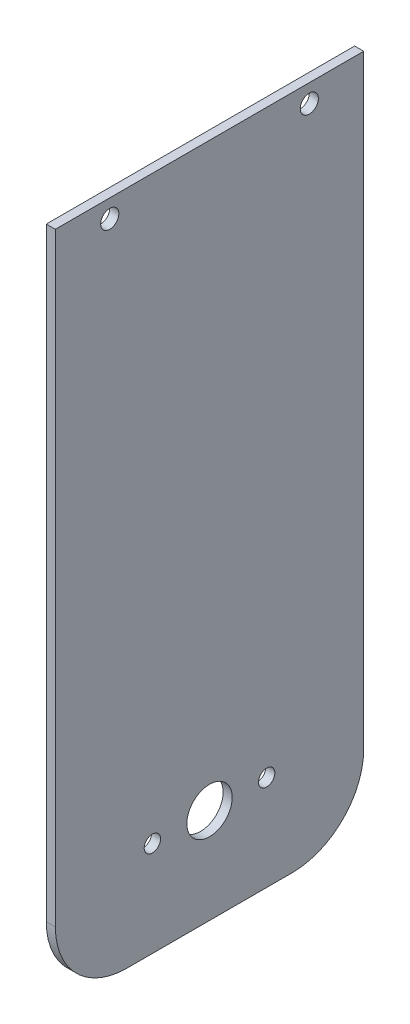
ISO-10303-21;
HEADER;
FILE_DESCRIPTION(('STEP AP214'),'2;1');
FILE_NAME('part.step','',(''),(''),'','','');
FILE_SCHEMA(('AUTOMOTIVE_DESIGN { 1 0 10303 214 1 1 1 1 }'));
ENDSEC;
DATA;
#1=APPLICATION_CONTEXT('core data for automotive mechanical design processes');
#2=APPLICATION_PROTOCOL_DEFINITION('international standard','automotive_design',2000,#1);
#3=PRODUCT_CONTEXT('',#1,'mechanical');
#4=PRODUCT('Part','Part','',(#3));
#5=PRODUCT_RELATED_PRODUCT_CATEGORY('part','',(#4));
#6=PRODUCT_DEFINITION_FORMATION('','',#4);
#7=PRODUCT_DEFINITION_CONTEXT('part definition',#1,'design');
#8=PRODUCT_DEFINITION('design','',#6,#7);
#9=PRODUCT_DEFINITION_SHAPE('','',#8);
#10=(LENGTH_UNIT() NAMED_UNIT(*) SI_UNIT(.MILLI.,.METRE.));
#11=(NAMED_UNIT(*) PLANE_ANGLE_UNIT() SI_UNIT($,.RADIAN.));
#12=(NAMED_UNIT(*) SI_UNIT($,.STERADIAN.) SOLID_ANGLE_UNIT());
#13=UNCERTAINTY_MEASURE_WITH_UNIT(LENGTH_MEASURE(1.E-05),#10,'distance_accuracy_value','');
#14=(GEOMETRIC_REPRESENTATION_CONTEXT(3) GLOBAL_UNCERTAINTY_ASSIGNED_CONTEXT((#13)) GLOBAL_UNIT_ASSIGNED_CONTEXT((#10,
#11,#12)) REPRESENTATION_CONTEXT('',''));
#15=CARTESIAN_POINT('',(0.,0.,0.));
#16=DIRECTION('',(0.,0.,1.));
#17=DIRECTION('',(1.,0.,0.));
#18=AXIS2_PLACEMENT_3D('',#15,#16,#17);
#19=CARTESIAN_POINT('',(3.175,0.,0.));
#20=DIRECTION('',(1.,0.,0.));
#21=DIRECTION('',(0.,0.,-1.));
#22=AXIS2_PLACEMENT_3D('',#19,#20,#21);
#23=PLANE('',#22);
#24=CARTESIAN_POINT('',(3.175,111.9175,34.925));
#25=DIRECTION('',(1.,0.,0.));
#26=DIRECTION('',(0.,0.,-1.));
#27=AXIS2_PLACEMENT_3D('',#24,#25,#26);
#28=CIRCLE('',#27,3.175);
#29=CARTESIAN_POINT('',(3.175,111.9175,31.75));
#30=VERTEX_POINT('',#29);
#31=EDGE_CURVE('E209',#30,#30,#28,.T.);
#32=ORIENTED_EDGE('',*,*,#31,.F.);
#33=EDGE_LOOP('',(#32));
#34=FACE_BOUND('',#33,.T.);
#35=CARTESIAN_POINT('',(3.175,-84.9275,-20.));
#36=DIRECTION('',(1.,0.,0.));
#37=DIRECTION('',(0.,0.,-1.));
#38=AXIS2_PLACEMENT_3D('',#35,#36,#37);
#39=CIRCLE('',#38,2.86);
#40=CARTESIAN_POINT('',(3.175,-84.9275,-22.86));
#41=VERTEX_POINT('',#40);
#42=EDGE_CURVE('E188',#41,#41,#39,.T.);
#43=ORIENTED_EDGE('',*,*,#42,.F.);
#44=EDGE_LOOP('',(#43));
#45=FACE_BOUND('',#44,.T.);
#46=DIRECTION('',(0.,-1.,0.));
#47=VECTOR('',#46,1.);
#48=CARTESIAN_POINT('',(3.175,118.2675,53.975));
#49=LINE('',#48,#47);
#50=CARTESIAN_POINT('',(3.175,118.2675,53.975));
#51=VERTEX_POINT('',#50);
#52=CARTESIAN_POINT('',(3.175,-93.2675,53.975));
#53=VERTEX_POINT('',#52);
#54=EDGE_CURVE('E124',#51,#53,#49,.T.);
#55=ORIENTED_EDGE('',*,*,#54,.T.);
#56=CARTESIAN_POINT('',(3.175,-93.2675,28.975));
#57=DIRECTION('',(1.,0.,0.));
#58=DIRECTION('',(0.,0.,-1.));
#59=AXIS2_PLACEMENT_3D('',#56,#57,#58);
#60=CIRCLE('',#59,25.);
#61=CARTESIAN_POINT('',(3.175,-118.2675,28.975));
#62=VERTEX_POINT('',#61);
#63=EDGE_CURVE('E61',#53,#62,#60,.T.);
#64=ORIENTED_EDGE('',*,*,#63,.T.);
#65=DIRECTION('',(0.,0.,-1.));
#66=VECTOR('',#65,1.);
#67=CARTESIAN_POINT('',(3.175,-118.2675,53.975));
#68=LINE('',#67,#66);
#69=CARTESIAN_POINT('',(3.175,-118.2675,-28.975));
#70=VERTEX_POINT('',#69);
#71=EDGE_CURVE('E137',#62,#70,#68,.T.);
#72=ORIENTED_EDGE('',*,*,#71,.T.);
#73=CARTESIAN_POINT('',(3.175,-93.2675,-28.975));
#74=DIRECTION('',(1.,0.,0.));
#75=DIRECTION('',(0.,0.,-1.));
#76=AXIS2_PLACEMENT_3D('',#73,#74,#75);
#77=CIRCLE('',#76,25.);
#78=CARTESIAN_POINT('',(3.175,-93.2675,-53.975));
#79=VERTEX_POINT('',#78);
#80=EDGE_CURVE('E68',#70,#79,#77,.T.);
#81=ORIENTED_EDGE('',*,*,#80,.T.);
#82=DIRECTION('',(0.,1.,0.));
#83=VECTOR('',#82,1.);
#84=CARTESIAN_POINT('',(3.175,118.2675,-53.975));
#85=LINE('',#84,#83);
#86=CARTESIAN_POINT('',(3.175,118.2675,-53.975));
#87=VERTEX_POINT('',#86);
#88=EDGE_CURVE('E106',#79,#87,#85,.T.);
#89=ORIENTED_EDGE('',*,*,#88,.T.);
#90=DIRECTION('',(0.,0.,1.));
#91=VECTOR('',#90,1.);
#92=CARTESIAN_POINT('',(3.175,118.2675,53.975));
#93=LINE('',#92,#91);
#94=EDGE_CURVE('E109',#87,#51,#93,.T.);
#95=ORIENTED_EDGE('',*,*,#94,.T.);
#96=EDGE_LOOP('',(#55,#64,#72,#81,#89,#95));
#97=FACE_BOUND('',#96,.T.);
#98=CARTESIAN_POINT('',(3.175,-84.9275,0.));
#99=DIRECTION('',(1.,0.,0.));
#100=DIRECTION('',(0.,0.,-1.));
#101=AXIS2_PLACEMENT_3D('',#98,#99,#100);
#102=CIRCLE('',#101,7.94);
#103=CARTESIAN_POINT('',(3.175,-84.9275,-7.94000000000003));
#104=VERTEX_POINT('',#103);
#105=EDGE_CURVE('E180',#104,#104,#102,.T.);
#106=ORIENTED_EDGE('',*,*,#105,.F.);
#107=EDGE_LOOP('',(#106));
#108=FACE_BOUND('',#107,.T.);
#109=CARTESIAN_POINT('',(3.175,-84.9275,20.));
#110=DIRECTION('',(1.,0.,0.));
#111=DIRECTION('',(0.,0.,-1.));
#112=AXIS2_PLACEMENT_3D('',#109,#110,#111);
#113=CIRCLE('',#112,2.86);
#114=CARTESIAN_POINT('',(3.175,-84.9275,17.14));
#115=VERTEX_POINT('',#114);
#116=EDGE_CURVE('E197',#115,#115,#113,.T.);
#117=ORIENTED_EDGE('',*,*,#116,.F.);
#118=EDGE_LOOP('',(#117));
#119=FACE_BOUND('',#118,.T.);
#120=CARTESIAN_POINT('',(3.175,111.9175,-34.925));
#121=DIRECTION('',(1.,0.,0.));
#122=DIRECTION('',(0.,0.,-1.));
#123=AXIS2_PLACEMENT_3D('',#120,#121,#122);
#124=CIRCLE('',#123,3.175);
#125=CARTESIAN_POINT('',(3.175,111.9175,-38.1));
#126=VERTEX_POINT('',#125);
#127=EDGE_CURVE('E219',#126,#126,#124,.T.);
#128=ORIENTED_EDGE('',*,*,#127,.F.);
#129=EDGE_LOOP('',(#128));
#130=FACE_BOUND('',#129,.T.);
#131=ADVANCED_FACE('F52',(#34,#45,#97,#108,#119,#130),#23,.T.);
#132=CARTESIAN_POINT('',(0.,0.,0.));
#133=DIRECTION('',(1.,0.,0.));
#134=DIRECTION('',(0.,0.,-1.));
#135=AXIS2_PLACEMENT_3D('',#132,#133,#134);
#136=PLANE('',#135);
#137=DIRECTION('',(0.,0.,-1.));
#138=VECTOR('',#137,1.);
#139=CARTESIAN_POINT('',(0.,-118.2675,53.975));
#140=LINE('',#139,#138);
#141=CARTESIAN_POINT('',(0.,-118.2675,28.975));
#142=VERTEX_POINT('',#141);
#143=CARTESIAN_POINT('',(0.,-118.2675,-28.975));
#144=VERTEX_POINT('',#143);
#145=EDGE_CURVE('E115',#142,#144,#140,.T.);
#146=ORIENTED_EDGE('',*,*,#145,.F.);
#147=CARTESIAN_POINT('',(0.,-93.2675,28.975));
#148=DIRECTION('',(1.,0.,0.));
#149=DIRECTION('',(0.,0.,-1.));
#150=AXIS2_PLACEMENT_3D('',#147,#148,#149);
#151=CIRCLE('',#150,25.);
#152=CARTESIAN_POINT('',(0.,-93.2675,53.975));
#153=VERTEX_POINT('',#152);
#154=EDGE_CURVE('E147',#142,#153,#151,.F.);
#155=ORIENTED_EDGE('',*,*,#154,.T.);
#156=DIRECTION('',(0.,-1.,0.));
#157=VECTOR('',#156,1.);
#158=CARTESIAN_POINT('',(0.,118.2675,53.975));
#159=LINE('',#158,#157);
#160=CARTESIAN_POINT('',(0.,118.2675,53.975));
#161=VERTEX_POINT('',#160);
#162=EDGE_CURVE('E170',#161,#153,#159,.T.);
#163=ORIENTED_EDGE('',*,*,#162,.F.);
#164=DIRECTION('',(0.,0.,1.));
#165=VECTOR('',#164,1.);
#166=CARTESIAN_POINT('',(0.,118.2675,53.975));
#167=LINE('',#166,#165);
#168=CARTESIAN_POINT('',(0.,118.2675,-53.975));
#169=VERTEX_POINT('',#168);
#170=EDGE_CURVE('E173',#169,#161,#167,.T.);
#171=ORIENTED_EDGE('',*,*,#170,.F.);
#172=DIRECTION('',(0.,1.,0.));
#173=VECTOR('',#172,1.);
#174=CARTESIAN_POINT('',(0.,118.2675,-53.975));
#175=LINE('',#174,#173);
#176=CARTESIAN_POINT('',(0.,-93.2675,-53.975));
#177=VERTEX_POINT('',#176);
#178=EDGE_CURVE('E128',#177,#169,#175,.T.);
#179=ORIENTED_EDGE('',*,*,#178,.F.);
#180=CARTESIAN_POINT('',(0.,-93.2675,-28.975));
#181=DIRECTION('',(1.,0.,0.));
#182=DIRECTION('',(0.,0.,-1.));
#183=AXIS2_PLACEMENT_3D('',#180,#181,#182);
#184=CIRCLE('',#183,25.);
#185=EDGE_CURVE('E144',#177,#144,#184,.F.);
#186=ORIENTED_EDGE('',*,*,#185,.T.);
#187=EDGE_LOOP('',(#146,#155,#163,#171,#179,#186));
#188=FACE_BOUND('',#187,.T.);
#189=CARTESIAN_POINT('',(0.,-84.9275,0.));
#190=DIRECTION('',(1.,0.,0.));
#191=DIRECTION('',(0.,0.,-1.));
#192=AXIS2_PLACEMENT_3D('',#189,#190,#191);
#193=CIRCLE('',#192,7.94);
#194=CARTESIAN_POINT('',(0.,-84.9275,-7.94000000000003));
#195=VERTEX_POINT('',#194);
#196=EDGE_CURVE('E184',#195,#195,#193,.T.);
#197=ORIENTED_EDGE('',*,*,#196,.T.);
#198=EDGE_LOOP('',(#197));
#199=FACE_BOUND('',#198,.T.);
#200=CARTESIAN_POINT('',(0.,-84.9275,-20.));
#201=DIRECTION('',(1.,0.,0.));
#202=DIRECTION('',(0.,0.,-1.));
#203=AXIS2_PLACEMENT_3D('',#200,#201,#202);
#204=CIRCLE('',#203,2.86);
#205=CARTESIAN_POINT('',(0.,-84.9275,-22.86));
#206=VERTEX_POINT('',#205);
#207=EDGE_CURVE('E192',#206,#206,#204,.T.);
#208=ORIENTED_EDGE('',*,*,#207,.T.);
#209=EDGE_LOOP('',(#208));
#210=FACE_BOUND('',#209,.T.);
#211=CARTESIAN_POINT('',(0.,-84.9275,20.));
#212=DIRECTION('',(1.,0.,0.));
#213=DIRECTION('',(0.,0.,-1.));
#214=AXIS2_PLACEMENT_3D('',#211,#212,#213);
#215=CIRCLE('',#214,2.86);
#216=CARTESIAN_POINT('',(0.,-84.9275,17.14));
#217=VERTEX_POINT('',#216);
#218=EDGE_CURVE('E205',#217,#217,#215,.T.);
#219=ORIENTED_EDGE('',*,*,#218,.T.);
#220=EDGE_LOOP('',(#219));
#221=FACE_BOUND('',#220,.T.);
#222=CARTESIAN_POINT('',(0.,111.9175,34.925));
#223=DIRECTION('',(1.,0.,0.));
#224=DIRECTION('',(0.,0.,-1.));
#225=AXIS2_PLACEMENT_3D('',#222,#223,#224);
#226=CIRCLE('',#225,3.175);
#227=CARTESIAN_POINT('',(0.,111.9175,31.75));
#228=VERTEX_POINT('',#227);
#229=EDGE_CURVE('E214',#228,#228,#226,.T.);
#230=ORIENTED_EDGE('',*,*,#229,.T.);
#231=EDGE_LOOP('',(#230));
#232=FACE_BOUND('',#231,.T.);
#233=CARTESIAN_POINT('',(0.,111.9175,-34.925));
#234=DIRECTION('',(1.,0.,0.));
#235=DIRECTION('',(0.,0.,-1.));
#236=AXIS2_PLACEMENT_3D('',#233,#234,#235);
#237=CIRCLE('',#236,3.175);
#238=CARTESIAN_POINT('',(0.,111.9175,-38.1));
#239=VERTEX_POINT('',#238);
#240=EDGE_CURVE('E224',#239,#239,#237,.T.);
#241=ORIENTED_EDGE('',*,*,#240,.T.);
#242=EDGE_LOOP('',(#241));
#243=FACE_BOUND('',#242,.T.);
#244=ADVANCED_FACE('F168',(#188,#199,#210,#221,#232,#243),#136,.F.);
#245=CARTESIAN_POINT('',(3.175,118.2675,-53.975));
#246=DIRECTION('',(0.,0.,1.));
#247=DIRECTION('',(0.,-1.,0.));
#248=AXIS2_PLACEMENT_3D('',#245,#246,#247);
#249=PLANE('',#248);
#250=ORIENTED_EDGE('',*,*,#88,.F.);
#251=DIRECTION('',(-1.,0.,0.));
#252=VECTOR('',#251,1.);
#253=CARTESIAN_POINT('',(3.175,-93.2675,-53.975));
#254=LINE('',#253,#252);
#255=EDGE_CURVE('E12',#79,#177,#254,.T.);
#256=ORIENTED_EDGE('',*,*,#255,.T.);
#257=ORIENTED_EDGE('',*,*,#178,.T.);
#258=DIRECTION('',(-1.,0.,0.));
#259=VECTOR('',#258,1.);
#260=CARTESIAN_POINT('',(3.175,118.2675,-53.975));
#261=LINE('',#260,#259);
#262=EDGE_CURVE('E120',#87,#169,#261,.T.);
#263=ORIENTED_EDGE('',*,*,#262,.F.);
#264=EDGE_LOOP('',(#250,#256,#257,#263));
#265=FACE_BOUND('',#264,.T.);
#266=ADVANCED_FACE('F126',(#265),#249,.F.);
#267=CARTESIAN_POINT('',(3.175,118.2675,53.975));
#268=DIRECTION('',(0.,-1.,0.));
#269=DIRECTION('',(0.,0.,-1.));
#270=AXIS2_PLACEMENT_3D('',#267,#268,#269);
#271=PLANE('',#270);
#272=ORIENTED_EDGE('',*,*,#170,.T.);
#273=DIRECTION('',(-1.,0.,0.));
#274=VECTOR('',#273,1.);
#275=CARTESIAN_POINT('',(3.175,118.2675,53.975));
#276=LINE('',#275,#274);
#277=EDGE_CURVE('E122',#51,#161,#276,.T.);
#278=ORIENTED_EDGE('',*,*,#277,.F.);
#279=ORIENTED_EDGE('',*,*,#94,.F.);
#280=ORIENTED_EDGE('',*,*,#262,.T.);
#281=EDGE_LOOP('',(#272,#278,#279,#280));
#282=FACE_BOUND('',#281,.T.);
#283=ADVANCED_FACE('F119',(#282),#271,.F.);
#284=CARTESIAN_POINT('',(3.175,118.2675,53.975));
#285=DIRECTION('',(0.,0.,-1.));
#286=DIRECTION('',(0.,1.,0.));
#287=AXIS2_PLACEMENT_3D('',#284,#285,#286);
#288=PLANE('',#287);
#289=ORIENTED_EDGE('',*,*,#162,.T.);
#290=DIRECTION('',(-1.,0.,0.));
#291=VECTOR('',#290,1.);
#292=CARTESIAN_POINT('',(3.175,-93.2675,53.975));
#293=LINE('',#292,#291);
#294=EDGE_CURVE('E76',#153,#53,#293,.F.);
#295=ORIENTED_EDGE('',*,*,#294,.T.);
#296=ORIENTED_EDGE('',*,*,#54,.F.);
#297=ORIENTED_EDGE('',*,*,#277,.T.);
#298=EDGE_LOOP('',(#289,#295,#296,#297));
#299=FACE_BOUND('',#298,.T.);
#300=ADVANCED_FACE('F171',(#299),#288,.F.);
#301=CARTESIAN_POINT('',(3.175,-118.2675,53.975));
#302=DIRECTION('',(0.,1.,0.));
#303=DIRECTION('',(0.,0.,1.));
#304=AXIS2_PLACEMENT_3D('',#301,#302,#303);
#305=PLANE('',#304);
#306=ORIENTED_EDGE('',*,*,#71,.F.);
#307=DIRECTION('',(-1.,0.,0.));
#308=VECTOR('',#307,1.);
#309=CARTESIAN_POINT('',(3.175,-118.2675,28.975));
#310=LINE('',#309,#308);
#311=EDGE_CURVE('E135',#62,#142,#310,.T.);
#312=ORIENTED_EDGE('',*,*,#311,.T.);
#313=ORIENTED_EDGE('',*,*,#145,.T.);
#314=DIRECTION('',(-1.,0.,0.));
#315=VECTOR('',#314,1.);
#316=CARTESIAN_POINT('',(3.175,-118.2675,-28.975));
#317=LINE('',#316,#315);
#318=EDGE_CURVE('E131',#144,#70,#317,.F.);
#319=ORIENTED_EDGE('',*,*,#318,.T.);
#320=EDGE_LOOP('',(#306,#312,#313,#319));
#321=FACE_BOUND('',#320,.T.);
#322=ADVANCED_FACE('F159',(#321),#305,.F.);
#323=CARTESIAN_POINT('',(3.175,-84.9275,0.));
#324=DIRECTION('',(-1.,0.,0.));
#325=DIRECTION('',(0.,0.,1.));
#326=AXIS2_PLACEMENT_3D('',#323,#324,#325);
#327=CYLINDRICAL_SURFACE('',#326,7.94);
#328=ORIENTED_EDGE('',*,*,#105,.T.);
#329=EDGE_LOOP('',(#328));
#330=FACE_BOUND('',#329,.T.);
#331=ORIENTED_EDGE('',*,*,#196,.F.);
#332=EDGE_LOOP('',(#331));
#333=FACE_BOUND('',#332,.T.);
#334=ADVANCED_FACE('F249',(#330,#333),#327,.F.);
#335=CARTESIAN_POINT('',(3.175,-84.9275,-20.));
#336=DIRECTION('',(-1.,0.,0.));
#337=DIRECTION('',(0.,0.,1.));
#338=AXIS2_PLACEMENT_3D('',#335,#336,#337);
#339=CYLINDRICAL_SURFACE('',#338,2.86);
#340=ORIENTED_EDGE('',*,*,#42,.T.);
#341=EDGE_LOOP('',(#340));
#342=FACE_BOUND('',#341,.T.);
#343=ORIENTED_EDGE('',*,*,#207,.F.);
#344=EDGE_LOOP('',(#343));
#345=FACE_BOUND('',#344,.T.);
#346=ADVANCED_FACE('F273',(#342,#345),#339,.F.);
#347=CARTESIAN_POINT('',(3.175,-84.9275,20.));
#348=DIRECTION('',(-1.,0.,0.));
#349=DIRECTION('',(0.,0.,1.));
#350=AXIS2_PLACEMENT_3D('',#347,#348,#349);
#351=CYLINDRICAL_SURFACE('',#350,2.86);
#352=ORIENTED_EDGE('',*,*,#116,.T.);
#353=EDGE_LOOP('',(#352));
#354=FACE_BOUND('',#353,.T.);
#355=ORIENTED_EDGE('',*,*,#218,.F.);
#356=EDGE_LOOP('',(#355));
#357=FACE_BOUND('',#356,.T.);
#358=ADVANCED_FACE('F268',(#354,#357),#351,.F.);
#359=CARTESIAN_POINT('',(3.175,111.9175,34.925));
#360=DIRECTION('',(-1.,0.,0.));
#361=DIRECTION('',(0.,0.,1.));
#362=AXIS2_PLACEMENT_3D('',#359,#360,#361);
#363=CYLINDRICAL_SURFACE('',#362,3.175);
#364=ORIENTED_EDGE('',*,*,#31,.T.);
#365=EDGE_LOOP('',(#364));
#366=FACE_BOUND('',#365,.T.);
#367=ORIENTED_EDGE('',*,*,#229,.F.);
#368=EDGE_LOOP('',(#367));
#369=FACE_BOUND('',#368,.T.);
#370=ADVANCED_FACE('F264',(#366,#369),#363,.F.);
#371=CARTESIAN_POINT('',(3.175,111.9175,-34.925));
#372=DIRECTION('',(-1.,0.,0.));
#373=DIRECTION('',(0.,0.,1.));
#374=AXIS2_PLACEMENT_3D('',#371,#372,#373);
#375=CYLINDRICAL_SURFACE('',#374,3.175);
#376=ORIENTED_EDGE('',*,*,#127,.T.);
#377=EDGE_LOOP('',(#376));
#378=FACE_BOUND('',#377,.T.);
#379=ORIENTED_EDGE('',*,*,#240,.F.);
#380=EDGE_LOOP('',(#379));
#381=FACE_BOUND('',#380,.T.);
#382=ADVANCED_FACE('F235',(#378,#381),#375,.F.);
#383=CARTESIAN_POINT('',(3.175,-93.2675,28.975));
#384=DIRECTION('',(-1.,0.,0.));
#385=DIRECTION('',(0.,0.,1.));
#386=AXIS2_PLACEMENT_3D('',#383,#384,#385);
#387=CYLINDRICAL_SURFACE('',#386,25.);
#388=ORIENTED_EDGE('',*,*,#63,.F.);
#389=ORIENTED_EDGE('',*,*,#294,.F.);
#390=ORIENTED_EDGE('',*,*,#154,.F.);
#391=ORIENTED_EDGE('',*,*,#311,.F.);
#392=EDGE_LOOP('',(#388,#389,#390,#391));
#393=FACE_BOUND('',#392,.T.);
#394=ADVANCED_FACE('F165',(#393),#387,.T.);
#395=CARTESIAN_POINT('',(3.175,-93.2675,-28.975));
#396=DIRECTION('',(-1.,0.,0.));
#397=DIRECTION('',(0.,0.,1.));
#398=AXIS2_PLACEMENT_3D('',#395,#396,#397);
#399=CYLINDRICAL_SURFACE('',#398,25.);
#400=ORIENTED_EDGE('',*,*,#80,.F.);
#401=ORIENTED_EDGE('',*,*,#318,.F.);
#402=ORIENTED_EDGE('',*,*,#185,.F.);
#403=ORIENTED_EDGE('',*,*,#255,.F.);
#404=EDGE_LOOP('',(#400,#401,#402,#403));
#405=FACE_BOUND('',#404,.T.);
#406=ADVANCED_FACE('F54',(#405),#399,.T.);
#407=CLOSED_SHELL('',(#131,#244,#266,#283,#300,#322,#334,#346,#358,#370,#382,#394,#406));
#408=MANIFOLD_SOLID_BREP('B2',#407);
#409=ADVANCED_BREP_SHAPE_REPRESENTATION('',(#18,#408),#14);
#410=SHAPE_DEFINITION_REPRESENTATION(#9,#409);
ENDSEC;
END-ISO-10303-21;
